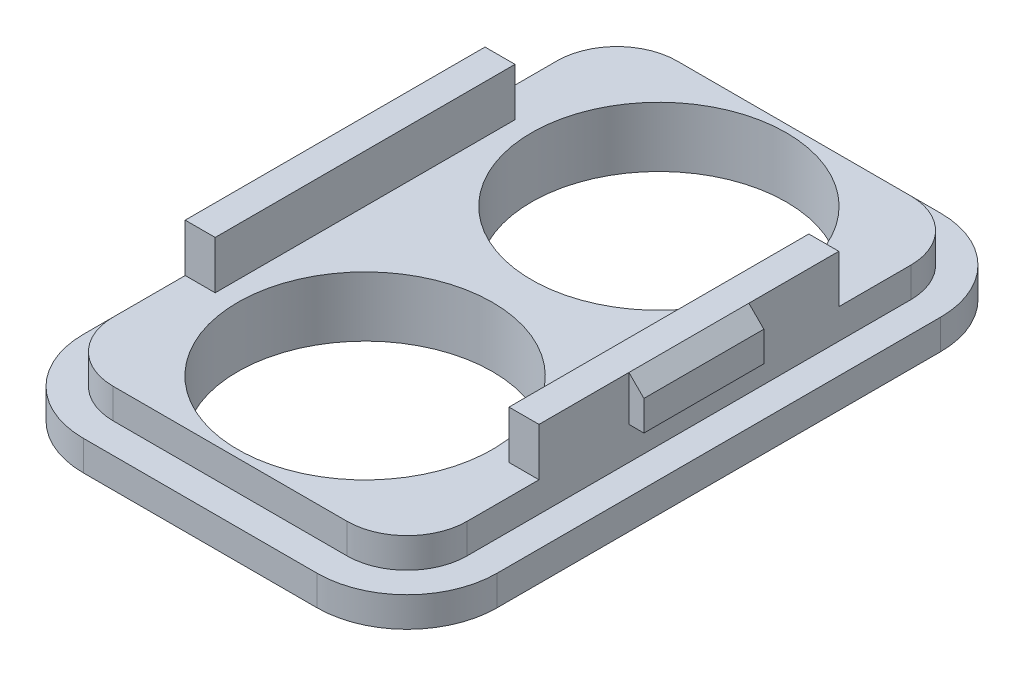
ISO-10303-21;
HEADER;
FILE_DESCRIPTION(('STEP AP214'),'2;1');
FILE_NAME('part.step','',(''),(''),'','','');
FILE_SCHEMA(('AUTOMOTIVE_DESIGN { 1 0 10303 214 1 1 1 1 }'));
ENDSEC;
DATA;
#1=APPLICATION_CONTEXT('core data for automotive mechanical design processes');
#2=APPLICATION_PROTOCOL_DEFINITION('international standard','automotive_design',2000,#1);
#3=PRODUCT_CONTEXT('',#1,'mechanical');
#4=PRODUCT('Part','Part','',(#3));
#5=PRODUCT_RELATED_PRODUCT_CATEGORY('part','',(#4));
#6=PRODUCT_DEFINITION_FORMATION('','',#4);
#7=PRODUCT_DEFINITION_CONTEXT('part definition',#1,'design');
#8=PRODUCT_DEFINITION('design','',#6,#7);
#9=PRODUCT_DEFINITION_SHAPE('','',#8);
#10=(LENGTH_UNIT() NAMED_UNIT(*) SI_UNIT(.MILLI.,.METRE.));
#11=(NAMED_UNIT(*) PLANE_ANGLE_UNIT() SI_UNIT($,.RADIAN.));
#12=(NAMED_UNIT(*) SI_UNIT($,.STERADIAN.) SOLID_ANGLE_UNIT());
#13=UNCERTAINTY_MEASURE_WITH_UNIT(LENGTH_MEASURE(1.E-05),#10,'distance_accuracy_value','');
#14=(GEOMETRIC_REPRESENTATION_CONTEXT(3) GLOBAL_UNCERTAINTY_ASSIGNED_CONTEXT((#13)) GLOBAL_UNIT_ASSIGNED_CONTEXT((#10,
#11,#12)) REPRESENTATION_CONTEXT('',''));
#15=CARTESIAN_POINT('',(0.,0.,0.));
#16=DIRECTION('',(0.,0.,1.));
#17=DIRECTION('',(1.,0.,0.));
#18=AXIS2_PLACEMENT_3D('',#15,#16,#17);
#19=CARTESIAN_POINT('',(2.,1.,-16.8));
#20=DIRECTION('',(0.,-1.,0.));
#21=DIRECTION('',(0.,0.,-1.));
#22=AXIS2_PLACEMENT_3D('',#19,#20,#21);
#23=PLANE('',#22);
#24=CARTESIAN_POINT('',(5.9,1.,-4.5));
#25=DIRECTION('',(0.,-1.,0.));
#26=DIRECTION('',(0.,0.,-1.));
#27=AXIS2_PLACEMENT_3D('',#24,#25,#26);
#28=CIRCLE('',#27,4.25);
#29=CARTESIAN_POINT('',(5.9,1.,-8.75));
#30=VERTEX_POINT('',#29);
#31=EDGE_CURVE('E265',#30,#30,#28,.T.);
#32=ORIENTED_EDGE('',*,*,#31,.T.);
#33=EDGE_LOOP('',(#32));
#34=FACE_BOUND('',#33,.T.);
#35=CARTESIAN_POINT('',(5.9,1.,-14.3));
#36=DIRECTION('',(0.,-1.,0.));
#37=DIRECTION('',(0.,0.,-1.));
#38=AXIS2_PLACEMENT_3D('',#35,#36,#37);
#39=CIRCLE('',#38,4.25);
#40=CARTESIAN_POINT('',(5.9,1.,-18.55));
#41=VERTEX_POINT('',#40);
#42=EDGE_CURVE('E1032',#41,#41,#39,.T.);
#43=ORIENTED_EDGE('',*,*,#42,.T.);
#44=EDGE_LOOP('',(#43));
#45=FACE_BOUND('',#44,.T.);
#46=DIRECTION('',(-1.,0.,0.));
#47=VECTOR('',#46,1.);
#48=CARTESIAN_POINT('',(11.8,1.,-14.4));
#49=LINE('',#48,#47);
#50=CARTESIAN_POINT('',(11.8,1.,-14.4));
#51=VERTEX_POINT('',#50);
#52=CARTESIAN_POINT('',(10.8,1.,-14.4));
#53=VERTEX_POINT('',#52);
#54=EDGE_CURVE('E307',#51,#53,#49,.T.);
#55=ORIENTED_EDGE('',*,*,#54,.F.);
#56=DIRECTION('',(0.,0.,-1.));
#57=VECTOR('',#56,1.);
#58=CARTESIAN_POINT('',(11.8,1.,-2.00000000000001));
#59=LINE('',#58,#57);
#60=CARTESIAN_POINT('',(11.8,1.,-16.8));
#61=VERTEX_POINT('',#60);
#62=EDGE_CURVE('E338',#51,#61,#59,.T.);
#63=ORIENTED_EDGE('',*,*,#62,.T.);
#64=CARTESIAN_POINT('',(9.8,1.,-16.8));
#65=DIRECTION('',(0.,1.,0.));
#66=DIRECTION('',(0.,0.,1.));
#67=AXIS2_PLACEMENT_3D('',#64,#65,#66);
#68=CIRCLE('',#67,2.);
#69=CARTESIAN_POINT('',(9.79999999999998,1.,-18.8));
#70=VERTEX_POINT('',#69);
#71=EDGE_CURVE('E341',#61,#70,#68,.T.);
#72=ORIENTED_EDGE('',*,*,#71,.T.);
#73=DIRECTION('',(-1.,0.,0.));
#74=VECTOR('',#73,1.);
#75=CARTESIAN_POINT('',(2.00000000000001,1.,-18.8));
#76=LINE('',#75,#74);
#77=CARTESIAN_POINT('',(2.00000000000001,1.,-18.8));
#78=VERTEX_POINT('',#77);
#79=EDGE_CURVE('E343',#70,#78,#76,.T.);
#80=ORIENTED_EDGE('',*,*,#79,.T.);
#81=CARTESIAN_POINT('',(2.,1.,-16.8));
#82=DIRECTION('',(0.,1.,0.));
#83=DIRECTION('',(0.,0.,-1.));
#84=AXIS2_PLACEMENT_3D('',#81,#82,#83);
#85=CIRCLE('',#84,2.);
#86=CARTESIAN_POINT('',(0.,1.,-16.8));
#87=VERTEX_POINT('',#86);
#88=EDGE_CURVE('E325',#78,#87,#85,.T.);
#89=ORIENTED_EDGE('',*,*,#88,.T.);
#90=DIRECTION('',(0.,0.,1.));
#91=VECTOR('',#90,1.);
#92=CARTESIAN_POINT('',(0.,1.,-2.00000000000001));
#93=LINE('',#92,#91);
#94=CARTESIAN_POINT('',(0.,1.,-14.4));
#95=VERTEX_POINT('',#94);
#96=EDGE_CURVE('E330',#87,#95,#93,.T.);
#97=ORIENTED_EDGE('',*,*,#96,.T.);
#98=DIRECTION('',(-1.,0.,0.));
#99=VECTOR('',#98,1.);
#100=CARTESIAN_POINT('',(0.,1.,-14.4));
#101=LINE('',#100,#99);
#102=CARTESIAN_POINT('',(0.999999999999995,1.,-14.4));
#103=VERTEX_POINT('',#102);
#104=EDGE_CURVE('E310',#103,#95,#101,.T.);
#105=ORIENTED_EDGE('',*,*,#104,.F.);
#106=DIRECTION('',(0.,0.,-1.));
#107=VECTOR('',#106,1.);
#108=CARTESIAN_POINT('',(0.999999999999995,1.,-14.4));
#109=LINE('',#108,#107);
#110=CARTESIAN_POINT('',(0.999999999999997,1.,-4.4));
#111=VERTEX_POINT('',#110);
#112=EDGE_CURVE('E306',#111,#103,#109,.T.);
#113=ORIENTED_EDGE('',*,*,#112,.F.);
#114=DIRECTION('',(1.,0.,0.));
#115=VECTOR('',#114,1.);
#116=CARTESIAN_POINT('',(0.,1.,-4.4));
#117=LINE('',#116,#115);
#118=CARTESIAN_POINT('',(0.,1.,-4.4));
#119=VERTEX_POINT('',#118);
#120=EDGE_CURVE('E303',#119,#111,#117,.T.);
#121=ORIENTED_EDGE('',*,*,#120,.F.);
#122=CARTESIAN_POINT('',(0.,1.,-2.00000000000001));
#123=VERTEX_POINT('',#122);
#124=EDGE_CURVE('E328',#119,#123,#93,.T.);
#125=ORIENTED_EDGE('',*,*,#124,.T.);
#126=CARTESIAN_POINT('',(2.,1.,-2.));
#127=DIRECTION('',(0.,1.,0.));
#128=DIRECTION('',(0.,0.,-1.));
#129=AXIS2_PLACEMENT_3D('',#126,#127,#128);
#130=CIRCLE('',#129,2.);
#131=CARTESIAN_POINT('',(2.00000000000001,1.,0.));
#132=VERTEX_POINT('',#131);
#133=EDGE_CURVE('E332',#123,#132,#130,.T.);
#134=ORIENTED_EDGE('',*,*,#133,.T.);
#135=DIRECTION('',(1.,0.,0.));
#136=VECTOR('',#135,1.);
#137=CARTESIAN_POINT('',(2.00000000000001,1.,0.));
#138=LINE('',#137,#136);
#139=CARTESIAN_POINT('',(9.79999999999999,1.,0.));
#140=VERTEX_POINT('',#139);
#141=EDGE_CURVE('E334',#132,#140,#138,.T.);
#142=ORIENTED_EDGE('',*,*,#141,.T.);
#143=CARTESIAN_POINT('',(9.8,1.,-2.));
#144=DIRECTION('',(0.,1.,0.));
#145=DIRECTION('',(0.,0.,1.));
#146=AXIS2_PLACEMENT_3D('',#143,#144,#145);
#147=CIRCLE('',#146,2.);
#148=CARTESIAN_POINT('',(11.8,1.,-2.00000000000001));
#149=VERTEX_POINT('',#148);
#150=EDGE_CURVE('E336',#140,#149,#147,.T.);
#151=ORIENTED_EDGE('',*,*,#150,.T.);
#152=CARTESIAN_POINT('',(11.8,1.,-4.40000000000001));
#153=VERTEX_POINT('',#152);
#154=EDGE_CURVE('E339',#149,#153,#59,.T.);
#155=ORIENTED_EDGE('',*,*,#154,.T.);
#156=DIRECTION('',(1.,0.,0.));
#157=VECTOR('',#156,1.);
#158=CARTESIAN_POINT('',(11.8,1.,-4.40000000000001));
#159=LINE('',#158,#157);
#160=CARTESIAN_POINT('',(10.8,1.,-4.40000000000001));
#161=VERTEX_POINT('',#160);
#162=EDGE_CURVE('E282',#161,#153,#159,.T.);
#163=ORIENTED_EDGE('',*,*,#162,.F.);
#164=DIRECTION('',(0.,0.,1.));
#165=VECTOR('',#164,1.);
#166=CARTESIAN_POINT('',(10.8,1.,-14.4));
#167=LINE('',#166,#165);
#168=EDGE_CURVE('E286',#53,#161,#167,.T.);
#169=ORIENTED_EDGE('',*,*,#168,.F.);
#170=EDGE_LOOP('',(#55,#63,#72,#80,#89,#97,#105,#113,#121,#125,#134,#142,#151,#155,#163,#169));
#171=FACE_BOUND('',#170,.T.);
#172=ADVANCED_FACE('F38',(#34,#45,#171),#23,.F.);
#173=CARTESIAN_POINT('',(2.,1.,-16.8));
#174=DIRECTION('',(0.,-1.,0.));
#175=DIRECTION('',(0.,0.,-1.));
#176=AXIS2_PLACEMENT_3D('',#173,#174,#175);
#177=CYLINDRICAL_SURFACE('',#176,2.);
#178=CARTESIAN_POINT('',(2.,0.,-16.8));
#179=DIRECTION('',(0.,1.,0.));
#180=DIRECTION('',(0.,0.,-1.));
#181=AXIS2_PLACEMENT_3D('',#178,#179,#180);
#182=CIRCLE('',#181,2.);
#183=CARTESIAN_POINT('',(2.00000000000001,0.,-18.8));
#184=VERTEX_POINT('',#183);
#185=CARTESIAN_POINT('',(0.,0.,-16.8));
#186=VERTEX_POINT('',#185);
#187=EDGE_CURVE('E324',#184,#186,#182,.T.);
#188=ORIENTED_EDGE('',*,*,#187,.T.);
#189=DIRECTION('',(0.,-1.,0.));
#190=VECTOR('',#189,1.);
#191=CARTESIAN_POINT('',(0.,1.,-16.8));
#192=LINE('',#191,#190);
#193=EDGE_CURVE('E11',#87,#186,#192,.T.);
#194=ORIENTED_EDGE('',*,*,#193,.F.);
#195=ORIENTED_EDGE('',*,*,#88,.F.);
#196=DIRECTION('',(0.,-1.,0.));
#197=VECTOR('',#196,1.);
#198=CARTESIAN_POINT('',(2.00000000000001,1.,-18.8));
#199=LINE('',#198,#197);
#200=EDGE_CURVE('E345',#78,#184,#199,.T.);
#201=ORIENTED_EDGE('',*,*,#200,.T.);
#202=EDGE_LOOP('',(#188,#194,#195,#201));
#203=FACE_BOUND('',#202,.T.);
#204=ADVANCED_FACE('F40',(#203),#177,.T.);
#205=CARTESIAN_POINT('',(0.,1.,-2.00000000000001));
#206=DIRECTION('',(1.,0.,0.));
#207=DIRECTION('',(0.,0.,-1.));
#208=AXIS2_PLACEMENT_3D('',#205,#206,#207);
#209=PLANE('',#208);
#210=DIRECTION('',(0.,0.,1.));
#211=VECTOR('',#210,1.);
#212=CARTESIAN_POINT('',(0.,1.1,-11.4));
#213=LINE('',#212,#211);
#214=CARTESIAN_POINT('',(0.,1.1,-11.4));
#215=VERTEX_POINT('',#214);
#216=CARTESIAN_POINT('',(0.,1.1,-7.4));
#217=VERTEX_POINT('',#216);
#218=EDGE_CURVE('E431',#215,#217,#213,.T.);
#219=ORIENTED_EDGE('',*,*,#218,.F.);
#220=DIRECTION('',(0.,1.,0.));
#221=VECTOR('',#220,1.);
#222=CARTESIAN_POINT('',(0.,2.6,-11.4));
#223=LINE('',#222,#221);
#224=CARTESIAN_POINT('',(0.,2.6,-11.4));
#225=VERTEX_POINT('',#224);
#226=EDGE_CURVE('E439',#215,#225,#223,.T.);
#227=ORIENTED_EDGE('',*,*,#226,.T.);
#228=DIRECTION('',(0.,0.,1.));
#229=VECTOR('',#228,1.);
#230=CARTESIAN_POINT('',(0.,2.6,-14.4));
#231=LINE('',#230,#229);
#232=CARTESIAN_POINT('',(0.,2.6,-14.4));
#233=VERTEX_POINT('',#232);
#234=EDGE_CURVE('E292',#233,#225,#231,.T.);
#235=ORIENTED_EDGE('',*,*,#234,.F.);
#236=DIRECTION('',(0.,-1.,0.));
#237=VECTOR('',#236,1.);
#238=CARTESIAN_POINT('',(0.,2.6,-14.4));
#239=LINE('',#238,#237);
#240=EDGE_CURVE('E302',#233,#95,#239,.T.);
#241=ORIENTED_EDGE('',*,*,#240,.T.);
#242=ORIENTED_EDGE('',*,*,#96,.F.);
#243=ORIENTED_EDGE('',*,*,#193,.T.);
#244=DIRECTION('',(0.,0.,1.));
#245=VECTOR('',#244,1.);
#246=CARTESIAN_POINT('',(0.,0.,-2.00000000000001));
#247=LINE('',#246,#245);
#248=CARTESIAN_POINT('',(0.,0.,-2.00000000000001));
#249=VERTEX_POINT('',#248);
#250=EDGE_CURVE('E348',#186,#249,#247,.T.);
#251=ORIENTED_EDGE('',*,*,#250,.T.);
#252=DIRECTION('',(0.,-1.,0.));
#253=VECTOR('',#252,1.);
#254=CARTESIAN_POINT('',(0.,1.,-2.00000000000001));
#255=LINE('',#254,#253);
#256=EDGE_CURVE('E46',#123,#249,#255,.T.);
#257=ORIENTED_EDGE('',*,*,#256,.F.);
#258=ORIENTED_EDGE('',*,*,#124,.F.);
#259=DIRECTION('',(0.,-1.,0.));
#260=VECTOR('',#259,1.);
#261=CARTESIAN_POINT('',(0.,2.6,-4.4));
#262=LINE('',#261,#260);
#263=CARTESIAN_POINT('',(0.,2.6,-4.4));
#264=VERTEX_POINT('',#263);
#265=EDGE_CURVE('E321',#264,#119,#262,.T.);
#266=ORIENTED_EDGE('',*,*,#265,.F.);
#267=CARTESIAN_POINT('',(0.,2.6,-7.4));
#268=VERTEX_POINT('',#267);
#269=EDGE_CURVE('E296',#268,#264,#231,.T.);
#270=ORIENTED_EDGE('',*,*,#269,.F.);
#271=DIRECTION('',(0.,1.,0.));
#272=VECTOR('',#271,1.);
#273=CARTESIAN_POINT('',(0.,2.6,-7.4));
#274=LINE('',#273,#272);
#275=EDGE_CURVE('E425',#217,#268,#274,.T.);
#276=ORIENTED_EDGE('',*,*,#275,.F.);
#277=EDGE_LOOP('',(#219,#227,#235,#241,#242,#243,#251,#257,#258,#266,#270,#276));
#278=FACE_BOUND('',#277,.T.);
#279=ADVANCED_FACE('F393',(#278),#209,.F.);
#280=CARTESIAN_POINT('',(2.,1.,-2.));
#281=DIRECTION('',(0.,-1.,0.));
#282=DIRECTION('',(0.,0.,-1.));
#283=AXIS2_PLACEMENT_3D('',#280,#281,#282);
#284=CYLINDRICAL_SURFACE('',#283,2.);
#285=CARTESIAN_POINT('',(2.,0.,-2.));
#286=DIRECTION('',(0.,1.,0.));
#287=DIRECTION('',(0.,0.,-1.));
#288=AXIS2_PLACEMENT_3D('',#285,#286,#287);
#289=CIRCLE('',#288,2.);
#290=CARTESIAN_POINT('',(2.00000000000001,0.,0.));
#291=VERTEX_POINT('',#290);
#292=EDGE_CURVE('E351',#249,#291,#289,.T.);
#293=ORIENTED_EDGE('',*,*,#292,.T.);
#294=DIRECTION('',(0.,-1.,0.));
#295=VECTOR('',#294,1.);
#296=CARTESIAN_POINT('',(2.00000000000001,1.,0.));
#297=LINE('',#296,#295);
#298=EDGE_CURVE('E382',#132,#291,#297,.T.);
#299=ORIENTED_EDGE('',*,*,#298,.F.);
#300=ORIENTED_EDGE('',*,*,#133,.F.);
#301=ORIENTED_EDGE('',*,*,#256,.T.);
#302=EDGE_LOOP('',(#293,#299,#300,#301));
#303=FACE_BOUND('',#302,.T.);
#304=ADVANCED_FACE('F388',(#303),#284,.T.);
#305=CARTESIAN_POINT('',(2.00000000000001,1.,0.));
#306=DIRECTION('',(0.,0.,-1.));
#307=DIRECTION('',(-1.,0.,0.));
#308=AXIS2_PLACEMENT_3D('',#305,#306,#307);
#309=PLANE('',#308);
#310=DIRECTION('',(1.,0.,0.));
#311=VECTOR('',#310,1.);
#312=CARTESIAN_POINT('',(2.00000000000001,0.,0.));
#313=LINE('',#312,#311);
#314=CARTESIAN_POINT('',(9.79999999999999,0.,0.));
#315=VERTEX_POINT('',#314);
#316=EDGE_CURVE('E354',#291,#315,#313,.T.);
#317=ORIENTED_EDGE('',*,*,#316,.T.);
#318=DIRECTION('',(0.,-1.,0.));
#319=VECTOR('',#318,1.);
#320=CARTESIAN_POINT('',(9.79999999999999,1.,0.));
#321=LINE('',#320,#319);
#322=EDGE_CURVE('E379',#140,#315,#321,.T.);
#323=ORIENTED_EDGE('',*,*,#322,.F.);
#324=ORIENTED_EDGE('',*,*,#141,.F.);
#325=ORIENTED_EDGE('',*,*,#298,.T.);
#326=EDGE_LOOP('',(#317,#323,#324,#325));
#327=FACE_BOUND('',#326,.T.);
#328=ADVANCED_FACE('F401',(#327),#309,.F.);
#329=CARTESIAN_POINT('',(9.8,1.,-2.));
#330=DIRECTION('',(0.,-1.,0.));
#331=DIRECTION('',(0.,0.,-1.));
#332=AXIS2_PLACEMENT_3D('',#329,#330,#331);
#333=CYLINDRICAL_SURFACE('',#332,2.);
#334=CARTESIAN_POINT('',(9.8,0.,-2.));
#335=DIRECTION('',(0.,1.,0.));
#336=DIRECTION('',(0.,0.,1.));
#337=AXIS2_PLACEMENT_3D('',#334,#335,#336);
#338=CIRCLE('',#337,2.);
#339=CARTESIAN_POINT('',(11.8,0.,-2.00000000000001));
#340=VERTEX_POINT('',#339);
#341=EDGE_CURVE('E357',#315,#340,#338,.T.);
#342=ORIENTED_EDGE('',*,*,#341,.T.);
#343=DIRECTION('',(0.,-1.,0.));
#344=VECTOR('',#343,1.);
#345=CARTESIAN_POINT('',(11.8,1.,-2.00000000000001));
#346=LINE('',#345,#344);
#347=EDGE_CURVE('E376',#149,#340,#346,.T.);
#348=ORIENTED_EDGE('',*,*,#347,.F.);
#349=ORIENTED_EDGE('',*,*,#150,.F.);
#350=ORIENTED_EDGE('',*,*,#322,.T.);
#351=EDGE_LOOP('',(#342,#348,#349,#350));
#352=FACE_BOUND('',#351,.T.);
#353=ADVANCED_FACE('F405',(#352),#333,.T.);
#354=CARTESIAN_POINT('',(11.8,1.,-2.00000000000001));
#355=DIRECTION('',(-1.,0.,0.));
#356=DIRECTION('',(0.,0.,1.));
#357=AXIS2_PLACEMENT_3D('',#354,#355,#356);
#358=PLANE('',#357);
#359=DIRECTION('',(0.,0.,-1.));
#360=VECTOR('',#359,1.);
#361=CARTESIAN_POINT('',(11.8,2.6,-14.4));
#362=LINE('',#361,#360);
#363=CARTESIAN_POINT('',(11.8,2.6,-11.4));
#364=VERTEX_POINT('',#363);
#365=CARTESIAN_POINT('',(11.8,2.6,-14.4));
#366=VERTEX_POINT('',#365);
#367=EDGE_CURVE('E283',#364,#366,#362,.T.);
#368=ORIENTED_EDGE('',*,*,#367,.F.);
#369=DIRECTION('',(0.,1.,0.));
#370=VECTOR('',#369,1.);
#371=CARTESIAN_POINT('',(11.8,2.6,-11.4));
#372=LINE('',#371,#370);
#373=CARTESIAN_POINT('',(11.8,1.1,-11.4));
#374=VERTEX_POINT('',#373);
#375=EDGE_CURVE('E475',#374,#364,#372,.T.);
#376=ORIENTED_EDGE('',*,*,#375,.F.);
#377=DIRECTION('',(0.,0.,1.));
#378=VECTOR('',#377,1.);
#379=CARTESIAN_POINT('',(11.8,1.1,-11.4));
#380=LINE('',#379,#378);
#381=CARTESIAN_POINT('',(11.8,1.1,-7.40000000000001));
#382=VERTEX_POINT('',#381);
#383=EDGE_CURVE('E254',#374,#382,#380,.T.);
#384=ORIENTED_EDGE('',*,*,#383,.T.);
#385=DIRECTION('',(0.,1.,0.));
#386=VECTOR('',#385,1.);
#387=CARTESIAN_POINT('',(11.8,2.6,-7.40000000000001));
#388=LINE('',#387,#386);
#389=CARTESIAN_POINT('',(11.8,2.6,-7.40000000000001));
#390=VERTEX_POINT('',#389);
#391=EDGE_CURVE('E261',#382,#390,#388,.T.);
#392=ORIENTED_EDGE('',*,*,#391,.T.);
#393=CARTESIAN_POINT('',(11.8,2.6,-4.40000000000001));
#394=VERTEX_POINT('',#393);
#395=EDGE_CURVE('E273',#394,#390,#362,.T.);
#396=ORIENTED_EDGE('',*,*,#395,.F.);
#397=DIRECTION('',(0.,-1.,0.));
#398=VECTOR('',#397,1.);
#399=CARTESIAN_POINT('',(11.8,2.6,-4.40000000000001));
#400=LINE('',#399,#398);
#401=EDGE_CURVE('E450',#394,#153,#400,.T.);
#402=ORIENTED_EDGE('',*,*,#401,.T.);
#403=ORIENTED_EDGE('',*,*,#154,.F.);
#404=ORIENTED_EDGE('',*,*,#347,.T.);
#405=DIRECTION('',(0.,0.,-1.));
#406=VECTOR('',#405,1.);
#407=CARTESIAN_POINT('',(11.8,0.,-2.00000000000001));
#408=LINE('',#407,#406);
#409=CARTESIAN_POINT('',(11.8,0.,-16.8));
#410=VERTEX_POINT('',#409);
#411=EDGE_CURVE('E360',#340,#410,#408,.T.);
#412=ORIENTED_EDGE('',*,*,#411,.T.);
#413=DIRECTION('',(0.,-1.,0.));
#414=VECTOR('',#413,1.);
#415=CARTESIAN_POINT('',(11.8,1.,-16.8));
#416=LINE('',#415,#414);
#417=EDGE_CURVE('E373',#61,#410,#416,.T.);
#418=ORIENTED_EDGE('',*,*,#417,.F.);
#419=ORIENTED_EDGE('',*,*,#62,.F.);
#420=DIRECTION('',(0.,-1.,0.));
#421=VECTOR('',#420,1.);
#422=CARTESIAN_POINT('',(11.8,2.6,-14.4));
#423=LINE('',#422,#421);
#424=EDGE_CURVE('E430',#366,#51,#423,.T.);
#425=ORIENTED_EDGE('',*,*,#424,.F.);
#426=EDGE_LOOP('',(#368,#376,#384,#392,#396,#402,#403,#404,#412,#418,#419,#425));
#427=FACE_BOUND('',#426,.T.);
#428=ADVANCED_FACE('F271',(#427),#358,.F.);
#429=CARTESIAN_POINT('',(9.8,1.,-16.8));
#430=DIRECTION('',(0.,-1.,0.));
#431=DIRECTION('',(0.,0.,-1.));
#432=AXIS2_PLACEMENT_3D('',#429,#430,#431);
#433=CYLINDRICAL_SURFACE('',#432,2.);
#434=CARTESIAN_POINT('',(9.8,0.,-16.8));
#435=DIRECTION('',(0.,1.,0.));
#436=DIRECTION('',(0.,0.,1.));
#437=AXIS2_PLACEMENT_3D('',#434,#435,#436);
#438=CIRCLE('',#437,2.);
#439=CARTESIAN_POINT('',(9.79999999999998,0.,-18.8));
#440=VERTEX_POINT('',#439);
#441=EDGE_CURVE('E363',#410,#440,#438,.T.);
#442=ORIENTED_EDGE('',*,*,#441,.T.);
#443=DIRECTION('',(0.,-1.,0.));
#444=VECTOR('',#443,1.);
#445=CARTESIAN_POINT('',(9.79999999999998,1.,-18.8));
#446=LINE('',#445,#444);
#447=EDGE_CURVE('E370',#70,#440,#446,.T.);
#448=ORIENTED_EDGE('',*,*,#447,.F.);
#449=ORIENTED_EDGE('',*,*,#71,.F.);
#450=ORIENTED_EDGE('',*,*,#417,.T.);
#451=EDGE_LOOP('',(#442,#448,#449,#450));
#452=FACE_BOUND('',#451,.T.);
#453=ADVANCED_FACE('F471',(#452),#433,.T.);
#454=CARTESIAN_POINT('',(2.00000000000001,1.,-18.8));
#455=DIRECTION('',(0.,0.,1.));
#456=DIRECTION('',(1.,0.,0.));
#457=AXIS2_PLACEMENT_3D('',#454,#455,#456);
#458=PLANE('',#457);
#459=DIRECTION('',(-1.,0.,0.));
#460=VECTOR('',#459,1.);
#461=CARTESIAN_POINT('',(2.00000000000001,0.,-18.8));
#462=LINE('',#461,#460);
#463=EDGE_CURVE('E329',#440,#184,#462,.T.);
#464=ORIENTED_EDGE('',*,*,#463,.T.);
#465=ORIENTED_EDGE('',*,*,#200,.F.);
#466=ORIENTED_EDGE('',*,*,#79,.F.);
#467=ORIENTED_EDGE('',*,*,#447,.T.);
#468=EDGE_LOOP('',(#464,#465,#466,#467));
#469=FACE_BOUND('',#468,.T.);
#470=ADVANCED_FACE('F596',(#469),#458,.F.);
#471=CARTESIAN_POINT('',(0.,2.6,-4.4));
#472=DIRECTION('',(0.,0.,-1.));
#473=DIRECTION('',(-1.,0.,0.));
#474=AXIS2_PLACEMENT_3D('',#471,#472,#473);
#475=PLANE('',#474);
#476=ORIENTED_EDGE('',*,*,#120,.T.);
#477=DIRECTION('',(0.,-1.,0.));
#478=VECTOR('',#477,1.);
#479=CARTESIAN_POINT('',(0.999999999999997,2.6,-4.4));
#480=LINE('',#479,#478);
#481=CARTESIAN_POINT('',(0.999999999999997,2.6,-4.4));
#482=VERTEX_POINT('',#481);
#483=EDGE_CURVE('E318',#482,#111,#480,.T.);
#484=ORIENTED_EDGE('',*,*,#483,.F.);
#485=DIRECTION('',(1.,0.,0.));
#486=VECTOR('',#485,1.);
#487=CARTESIAN_POINT('',(0.,2.6,-4.4));
#488=LINE('',#487,#486);
#489=EDGE_CURVE('E295',#264,#482,#488,.T.);
#490=ORIENTED_EDGE('',*,*,#489,.F.);
#491=ORIENTED_EDGE('',*,*,#265,.T.);
#492=EDGE_LOOP('',(#476,#484,#490,#491));
#493=FACE_BOUND('',#492,.T.);
#494=ADVANCED_FACE('F412',(#493),#475,.F.);
#495=CARTESIAN_POINT('',(0.999999999999995,2.6,-14.4));
#496=DIRECTION('',(-1.,0.,0.));
#497=DIRECTION('',(0.,0.,1.));
#498=AXIS2_PLACEMENT_3D('',#495,#496,#497);
#499=PLANE('',#498);
#500=ORIENTED_EDGE('',*,*,#112,.T.);
#501=DIRECTION('',(0.,-1.,0.));
#502=VECTOR('',#501,1.);
#503=CARTESIAN_POINT('',(0.999999999999995,2.6,-14.4));
#504=LINE('',#503,#502);
#505=CARTESIAN_POINT('',(0.999999999999995,2.6,-14.4));
#506=VERTEX_POINT('',#505);
#507=EDGE_CURVE('E315',#506,#103,#504,.T.);
#508=ORIENTED_EDGE('',*,*,#507,.F.);
#509=DIRECTION('',(0.,0.,-1.));
#510=VECTOR('',#509,1.);
#511=CARTESIAN_POINT('',(0.999999999999995,2.6,-14.4));
#512=LINE('',#511,#510);
#513=EDGE_CURVE('E298',#482,#506,#512,.T.);
#514=ORIENTED_EDGE('',*,*,#513,.F.);
#515=ORIENTED_EDGE('',*,*,#483,.T.);
#516=EDGE_LOOP('',(#500,#508,#514,#515));
#517=FACE_BOUND('',#516,.T.);
#518=ADVANCED_FACE('F416',(#517),#499,.F.);
#519=CARTESIAN_POINT('',(0.,2.6,-14.4));
#520=DIRECTION('',(0.,0.,1.));
#521=DIRECTION('',(1.,0.,0.));
#522=AXIS2_PLACEMENT_3D('',#519,#520,#521);
#523=PLANE('',#522);
#524=ORIENTED_EDGE('',*,*,#104,.T.);
#525=ORIENTED_EDGE('',*,*,#240,.F.);
#526=DIRECTION('',(-1.,0.,0.));
#527=VECTOR('',#526,1.);
#528=CARTESIAN_POINT('',(0.,2.6,-14.4));
#529=LINE('',#528,#527);
#530=EDGE_CURVE('E300',#506,#233,#529,.T.);
#531=ORIENTED_EDGE('',*,*,#530,.F.);
#532=ORIENTED_EDGE('',*,*,#507,.T.);
#533=EDGE_LOOP('',(#524,#525,#531,#532));
#534=FACE_BOUND('',#533,.T.);
#535=ADVANCED_FACE('F652',(#534),#523,.F.);
#536=CARTESIAN_POINT('',(0.,2.6,0.));
#537=DIRECTION('',(0.,1.,0.));
#538=DIRECTION('',(0.,0.,1.));
#539=AXIS2_PLACEMENT_3D('',#536,#537,#538);
#540=PLANE('',#539);
#541=ORIENTED_EDGE('',*,*,#234,.T.);
#542=DIRECTION('',(0.,0.,1.));
#543=VECTOR('',#542,1.);
#544=CARTESIAN_POINT('',(0.,2.6,-11.4));
#545=LINE('',#544,#543);
#546=EDGE_CURVE('E426',#225,#268,#545,.T.);
#547=ORIENTED_EDGE('',*,*,#546,.T.);
#548=ORIENTED_EDGE('',*,*,#269,.T.);
#549=ORIENTED_EDGE('',*,*,#489,.T.);
#550=ORIENTED_EDGE('',*,*,#513,.T.);
#551=ORIENTED_EDGE('',*,*,#530,.T.);
#552=EDGE_LOOP('',(#541,#547,#548,#549,#550,#551));
#553=FACE_BOUND('',#552,.T.);
#554=ADVANCED_FACE('F420',(#553),#540,.T.);
#555=CARTESIAN_POINT('',(11.8,2.6,-14.4));
#556=DIRECTION('',(0.,0.,1.));
#557=DIRECTION('',(1.,0.,0.));
#558=AXIS2_PLACEMENT_3D('',#555,#556,#557);
#559=PLANE('',#558);
#560=ORIENTED_EDGE('',*,*,#54,.T.);
#561=DIRECTION('',(0.,-1.,0.));
#562=VECTOR('',#561,1.);
#563=CARTESIAN_POINT('',(10.8,2.6,-14.4));
#564=LINE('',#563,#562);
#565=CARTESIAN_POINT('',(10.8,2.6,-14.4));
#566=VERTEX_POINT('',#565);
#567=EDGE_CURVE('E434',#566,#53,#564,.T.);
#568=ORIENTED_EDGE('',*,*,#567,.F.);
#569=DIRECTION('',(-1.,0.,0.));
#570=VECTOR('',#569,1.);
#571=CARTESIAN_POINT('',(11.8,2.6,-14.4));
#572=LINE('',#571,#570);
#573=EDGE_CURVE('E288',#366,#566,#572,.T.);
#574=ORIENTED_EDGE('',*,*,#573,.F.);
#575=ORIENTED_EDGE('',*,*,#424,.T.);
#576=EDGE_LOOP('',(#560,#568,#574,#575));
#577=FACE_BOUND('',#576,.T.);
#578=ADVANCED_FACE('F463',(#577),#559,.F.);
#579=CARTESIAN_POINT('',(10.8,2.6,-14.4));
#580=DIRECTION('',(1.,0.,0.));
#581=DIRECTION('',(0.,0.,-1.));
#582=AXIS2_PLACEMENT_3D('',#579,#580,#581);
#583=PLANE('',#582);
#584=ORIENTED_EDGE('',*,*,#168,.T.);
#585=DIRECTION('',(0.,-1.,0.));
#586=VECTOR('',#585,1.);
#587=CARTESIAN_POINT('',(10.8,2.6,-4.40000000000001));
#588=LINE('',#587,#586);
#589=CARTESIAN_POINT('',(10.8,2.6,-4.40000000000001));
#590=VERTEX_POINT('',#589);
#591=EDGE_CURVE('E447',#590,#161,#588,.T.);
#592=ORIENTED_EDGE('',*,*,#591,.F.);
#593=DIRECTION('',(0.,0.,1.));
#594=VECTOR('',#593,1.);
#595=CARTESIAN_POINT('',(10.8,2.6,-14.4));
#596=LINE('',#595,#594);
#597=EDGE_CURVE('E456',#566,#590,#596,.T.);
#598=ORIENTED_EDGE('',*,*,#597,.F.);
#599=ORIENTED_EDGE('',*,*,#567,.T.);
#600=EDGE_LOOP('',(#584,#592,#598,#599));
#601=FACE_BOUND('',#600,.T.);
#602=ADVANCED_FACE('F465',(#601),#583,.F.);
#603=CARTESIAN_POINT('',(11.8,2.6,-4.40000000000001));
#604=DIRECTION('',(0.,0.,-1.));
#605=DIRECTION('',(-1.,0.,0.));
#606=AXIS2_PLACEMENT_3D('',#603,#604,#605);
#607=PLANE('',#606);
#608=ORIENTED_EDGE('',*,*,#162,.T.);
#609=ORIENTED_EDGE('',*,*,#401,.F.);
#610=DIRECTION('',(1.,0.,0.));
#611=VECTOR('',#610,1.);
#612=CARTESIAN_POINT('',(11.8,2.6,-4.40000000000001));
#613=LINE('',#612,#611);
#614=EDGE_CURVE('E280',#590,#394,#613,.T.);
#615=ORIENTED_EDGE('',*,*,#614,.F.);
#616=ORIENTED_EDGE('',*,*,#591,.T.);
#617=EDGE_LOOP('',(#608,#609,#615,#616));
#618=FACE_BOUND('',#617,.T.);
#619=ADVANCED_FACE('F467',(#618),#607,.F.);
#620=CARTESIAN_POINT('',(0.,2.6,0.));
#621=DIRECTION('',(0.,-1.,0.));
#622=DIRECTION('',(0.,0.,-1.));
#623=AXIS2_PLACEMENT_3D('',#620,#621,#622);
#624=PLANE('',#623);
#625=ORIENTED_EDGE('',*,*,#395,.T.);
#626=DIRECTION('',(0.,0.,1.));
#627=VECTOR('',#626,1.);
#628=CARTESIAN_POINT('',(11.8,2.6,-11.4));
#629=LINE('',#628,#627);
#630=EDGE_CURVE('E247',#364,#390,#629,.T.);
#631=ORIENTED_EDGE('',*,*,#630,.F.);
#632=ORIENTED_EDGE('',*,*,#367,.T.);
#633=ORIENTED_EDGE('',*,*,#573,.T.);
#634=ORIENTED_EDGE('',*,*,#597,.T.);
#635=ORIENTED_EDGE('',*,*,#614,.T.);
#636=EDGE_LOOP('',(#625,#631,#632,#633,#634,#635));
#637=FACE_BOUND('',#636,.T.);
#638=ADVANCED_FACE('F278',(#637),#624,.F.);
#639=CARTESIAN_POINT('',(-0.5,2.1,-11.4));
#640=DIRECTION('',(-0.707106781186551,0.707106781186544,0.));
#641=DIRECTION('',(-0.707106781186544,-0.707106781186551,0.));
#642=AXIS2_PLACEMENT_3D('',#639,#640,#641);
#643=PLANE('',#642);
#644=DIRECTION('',(0.,0.,1.));
#645=VECTOR('',#644,1.);
#646=CARTESIAN_POINT('',(-0.5,2.1,-11.4));
#647=LINE('',#646,#645);
#648=CARTESIAN_POINT('',(-0.5,2.1,-11.4));
#649=VERTEX_POINT('',#648);
#650=CARTESIAN_POINT('',(-0.5,2.1,-7.4));
#651=VERTEX_POINT('',#650);
#652=EDGE_CURVE('E443',#649,#651,#647,.T.);
#653=ORIENTED_EDGE('',*,*,#652,.T.);
#654=DIRECTION('',(-0.707106781186544,-0.707106781186551,0.));
#655=VECTOR('',#654,1.);
#656=CARTESIAN_POINT('',(-0.5,2.1,-7.4));
#657=LINE('',#656,#655);
#658=EDGE_CURVE('E61',#268,#651,#657,.T.);
#659=ORIENTED_EDGE('',*,*,#658,.F.);
#660=ORIENTED_EDGE('',*,*,#546,.F.);
#661=DIRECTION('',(-0.707106781186544,-0.707106781186551,0.));
#662=VECTOR('',#661,1.);
#663=CARTESIAN_POINT('',(-0.5,2.1,-11.4));
#664=LINE('',#663,#662);
#665=EDGE_CURVE('E555',#225,#649,#664,.T.);
#666=ORIENTED_EDGE('',*,*,#665,.T.);
#667=EDGE_LOOP('',(#653,#659,#660,#666));
#668=FACE_BOUND('',#667,.T.);
#669=ADVANCED_FACE('F567',(#668),#643,.T.);
#670=CARTESIAN_POINT('',(0.,1.1,-11.4));
#671=DIRECTION('',(0.,-1.,0.));
#672=DIRECTION('',(0.,0.,-1.));
#673=AXIS2_PLACEMENT_3D('',#670,#671,#672);
#674=PLANE('',#673);
#675=ORIENTED_EDGE('',*,*,#218,.T.);
#676=DIRECTION('',(1.,0.,0.));
#677=VECTOR('',#676,1.);
#678=CARTESIAN_POINT('',(0.,1.1,-7.4));
#679=LINE('',#678,#677);
#680=CARTESIAN_POINT('',(-0.5,1.1,-7.4));
#681=VERTEX_POINT('',#680);
#682=EDGE_CURVE('E551',#681,#217,#679,.T.);
#683=ORIENTED_EDGE('',*,*,#682,.F.);
#684=DIRECTION('',(0.,0.,1.));
#685=VECTOR('',#684,1.);
#686=CARTESIAN_POINT('',(-0.5,1.1,-11.4));
#687=LINE('',#686,#685);
#688=CARTESIAN_POINT('',(-0.5,1.1,-11.4));
#689=VERTEX_POINT('',#688);
#690=EDGE_CURVE('E436',#689,#681,#687,.T.);
#691=ORIENTED_EDGE('',*,*,#690,.F.);
#692=DIRECTION('',(1.,0.,0.));
#693=VECTOR('',#692,1.);
#694=CARTESIAN_POINT('',(0.,1.1,-11.4));
#695=LINE('',#694,#693);
#696=EDGE_CURVE('E559',#689,#215,#695,.T.);
#697=ORIENTED_EDGE('',*,*,#696,.T.);
#698=EDGE_LOOP('',(#675,#683,#691,#697));
#699=FACE_BOUND('',#698,.T.);
#700=ADVANCED_FACE('F574',(#699),#674,.T.);
#701=CARTESIAN_POINT('',(-0.5,1.1,-11.4));
#702=DIRECTION('',(-1.,0.,0.));
#703=DIRECTION('',(0.,-1.,0.));
#704=AXIS2_PLACEMENT_3D('',#701,#702,#703);
#705=PLANE('',#704);
#706=ORIENTED_EDGE('',*,*,#690,.T.);
#707=DIRECTION('',(0.,-1.,0.));
#708=VECTOR('',#707,1.);
#709=CARTESIAN_POINT('',(-0.5,1.1,-7.4));
#710=LINE('',#709,#708);
#711=EDGE_CURVE('E548',#651,#681,#710,.T.);
#712=ORIENTED_EDGE('',*,*,#711,.F.);
#713=ORIENTED_EDGE('',*,*,#652,.F.);
#714=DIRECTION('',(0.,-1.,0.));
#715=VECTOR('',#714,1.);
#716=CARTESIAN_POINT('',(-0.5,1.1,-11.4));
#717=LINE('',#716,#715);
#718=EDGE_CURVE('E557',#649,#689,#717,.T.);
#719=ORIENTED_EDGE('',*,*,#718,.T.);
#720=EDGE_LOOP('',(#706,#712,#713,#719));
#721=FACE_BOUND('',#720,.T.);
#722=ADVANCED_FACE('F570',(#721),#705,.T.);
#723=CARTESIAN_POINT('',(0.,0.,-11.4));
#724=DIRECTION('',(0.,0.,-1.));
#725=DIRECTION('',(-1.,0.,0.));
#726=AXIS2_PLACEMENT_3D('',#723,#724,#725);
#727=PLANE('',#726);
#728=ORIENTED_EDGE('',*,*,#665,.F.);
#729=ORIENTED_EDGE('',*,*,#226,.F.);
#730=ORIENTED_EDGE('',*,*,#696,.F.);
#731=ORIENTED_EDGE('',*,*,#718,.F.);
#732=EDGE_LOOP('',(#728,#729,#730,#731));
#733=FACE_BOUND('',#732,.T.);
#734=ADVANCED_FACE('F565',(#733),#727,.T.);
#735=CARTESIAN_POINT('',(0.,0.,-7.4));
#736=DIRECTION('',(0.,0.,-1.));
#737=DIRECTION('',(-1.,0.,0.));
#738=AXIS2_PLACEMENT_3D('',#735,#736,#737);
#739=PLANE('',#738);
#740=ORIENTED_EDGE('',*,*,#658,.T.);
#741=ORIENTED_EDGE('',*,*,#711,.T.);
#742=ORIENTED_EDGE('',*,*,#682,.T.);
#743=ORIENTED_EDGE('',*,*,#275,.T.);
#744=EDGE_LOOP('',(#740,#741,#742,#743));
#745=FACE_BOUND('',#744,.T.);
#746=ADVANCED_FACE('F573',(#745),#739,.F.);
#747=CARTESIAN_POINT('',(2.,-1.,-16.8));
#748=DIRECTION('',(0.,1.,0.));
#749=DIRECTION('',(0.,0.,1.));
#750=AXIS2_PLACEMENT_3D('',#747,#748,#749);
#751=CYLINDRICAL_SURFACE('',#750,3.);
#752=CARTESIAN_POINT('',(2.,0.,-16.8));
#753=DIRECTION('',(0.,-1.,0.));
#754=DIRECTION('',(0.,0.,-1.));
#755=AXIS2_PLACEMENT_3D('',#752,#753,#754);
#756=CIRCLE('',#755,3.);
#757=CARTESIAN_POINT('',(-1.,0.,-16.8));
#758=VERTEX_POINT('',#757);
#759=CARTESIAN_POINT('',(2.00000000000002,0.,-19.8));
#760=VERTEX_POINT('',#759);
#761=EDGE_CURVE('E486',#758,#760,#756,.T.);
#762=ORIENTED_EDGE('',*,*,#761,.T.);
#763=DIRECTION('',(0.,1.,0.));
#764=VECTOR('',#763,1.);
#765=CARTESIAN_POINT('',(2.00000000000002,-1.,-19.8));
#766=LINE('',#765,#764);
#767=CARTESIAN_POINT('',(2.00000000000002,-1.,-19.8));
#768=VERTEX_POINT('',#767);
#769=EDGE_CURVE('E544',#768,#760,#766,.T.);
#770=ORIENTED_EDGE('',*,*,#769,.F.);
#771=CARTESIAN_POINT('',(2.,-1.,-16.8));
#772=DIRECTION('',(0.,-1.,0.));
#773=DIRECTION('',(0.,0.,-1.));
#774=AXIS2_PLACEMENT_3D('',#771,#772,#773);
#775=CIRCLE('',#774,3.);
#776=CARTESIAN_POINT('',(-1.,-1.,-16.8));
#777=VERTEX_POINT('',#776);
#778=EDGE_CURVE('E490',#777,#768,#775,.T.);
#779=ORIENTED_EDGE('',*,*,#778,.F.);
#780=DIRECTION('',(0.,1.,0.));
#781=VECTOR('',#780,1.);
#782=CARTESIAN_POINT('',(-1.,-1.,-16.8));
#783=LINE('',#782,#781);
#784=EDGE_CURVE('E508',#777,#758,#783,.T.);
#785=ORIENTED_EDGE('',*,*,#784,.T.);
#786=EDGE_LOOP('',(#762,#770,#779,#785));
#787=FACE_BOUND('',#786,.T.);
#788=ADVANCED_FACE('F722',(#787),#751,.T.);
#789=CARTESIAN_POINT('',(2.00000000000002,-1.,-19.8));
#790=DIRECTION('',(0.,0.,1.));
#791=DIRECTION('',(1.,0.,0.));
#792=AXIS2_PLACEMENT_3D('',#789,#790,#791);
#793=PLANE('',#792);
#794=DIRECTION('',(1.,0.,0.));
#795=VECTOR('',#794,1.);
#796=CARTESIAN_POINT('',(2.00000000000002,0.,-19.8));
#797=LINE('',#796,#795);
#798=CARTESIAN_POINT('',(9.79999999999998,0.,-19.8));
#799=VERTEX_POINT('',#798);
#800=EDGE_CURVE('E511',#760,#799,#797,.T.);
#801=ORIENTED_EDGE('',*,*,#800,.T.);
#802=DIRECTION('',(0.,1.,0.));
#803=VECTOR('',#802,1.);
#804=CARTESIAN_POINT('',(9.79999999999998,-1.,-19.8));
#805=LINE('',#804,#803);
#806=CARTESIAN_POINT('',(9.79999999999998,-1.,-19.8));
#807=VERTEX_POINT('',#806);
#808=EDGE_CURVE('E541',#807,#799,#805,.T.);
#809=ORIENTED_EDGE('',*,*,#808,.F.);
#810=DIRECTION('',(1.,0.,0.));
#811=VECTOR('',#810,1.);
#812=CARTESIAN_POINT('',(2.00000000000002,-1.,-19.8));
#813=LINE('',#812,#811);
#814=EDGE_CURVE('E493',#768,#807,#813,.T.);
#815=ORIENTED_EDGE('',*,*,#814,.F.);
#816=ORIENTED_EDGE('',*,*,#769,.T.);
#817=EDGE_LOOP('',(#801,#809,#815,#816));
#818=FACE_BOUND('',#817,.T.);
#819=ADVANCED_FACE('F921',(#818),#793,.F.);
#820=CARTESIAN_POINT('',(9.8,-1.,-16.8));
#821=DIRECTION('',(0.,1.,0.));
#822=DIRECTION('',(0.,0.,1.));
#823=AXIS2_PLACEMENT_3D('',#820,#821,#822);
#824=CYLINDRICAL_SURFACE('',#823,3.);
#825=CARTESIAN_POINT('',(9.8,0.,-16.8));
#826=DIRECTION('',(0.,-1.,0.));
#827=DIRECTION('',(0.,0.,-1.));
#828=AXIS2_PLACEMENT_3D('',#825,#826,#827);
#829=CIRCLE('',#828,3.);
#830=CARTESIAN_POINT('',(12.8,0.,-16.8));
#831=VERTEX_POINT('',#830);
#832=EDGE_CURVE('E513',#799,#831,#829,.T.);
#833=ORIENTED_EDGE('',*,*,#832,.T.);
#834=DIRECTION('',(0.,1.,0.));
#835=VECTOR('',#834,1.);
#836=CARTESIAN_POINT('',(12.8,-1.,-16.8));
#837=LINE('',#836,#835);
#838=CARTESIAN_POINT('',(12.8,-1.,-16.8));
#839=VERTEX_POINT('',#838);
#840=EDGE_CURVE('E538',#839,#831,#837,.T.);
#841=ORIENTED_EDGE('',*,*,#840,.F.);
#842=CARTESIAN_POINT('',(9.8,-1.,-16.8));
#843=DIRECTION('',(0.,-1.,0.));
#844=DIRECTION('',(0.,0.,-1.));
#845=AXIS2_PLACEMENT_3D('',#842,#843,#844);
#846=CIRCLE('',#845,3.);
#847=EDGE_CURVE('E496',#807,#839,#846,.T.);
#848=ORIENTED_EDGE('',*,*,#847,.F.);
#849=ORIENTED_EDGE('',*,*,#808,.T.);
#850=EDGE_LOOP('',(#833,#841,#848,#849));
#851=FACE_BOUND('',#850,.T.);
#852=ADVANCED_FACE('F911',(#851),#824,.T.);
#853=CARTESIAN_POINT('',(12.8,-1.,-16.8));
#854=DIRECTION('',(-1.,0.,0.));
#855=DIRECTION('',(0.,0.,1.));
#856=AXIS2_PLACEMENT_3D('',#853,#854,#855);
#857=PLANE('',#856);
#858=DIRECTION('',(0.,0.,1.));
#859=VECTOR('',#858,1.);
#860=CARTESIAN_POINT('',(12.8,0.,-16.8));
#861=LINE('',#860,#859);
#862=CARTESIAN_POINT('',(12.8,0.,-2.00000000000001));
#863=VERTEX_POINT('',#862);
#864=EDGE_CURVE('E515',#831,#863,#861,.T.);
#865=ORIENTED_EDGE('',*,*,#864,.T.);
#866=DIRECTION('',(0.,1.,0.));
#867=VECTOR('',#866,1.);
#868=CARTESIAN_POINT('',(12.8,-1.,-2.00000000000001));
#869=LINE('',#868,#867);
#870=CARTESIAN_POINT('',(12.8,-1.,-2.00000000000001));
#871=VERTEX_POINT('',#870);
#872=EDGE_CURVE('E535',#871,#863,#869,.T.);
#873=ORIENTED_EDGE('',*,*,#872,.F.);
#874=DIRECTION('',(0.,0.,1.));
#875=VECTOR('',#874,1.);
#876=CARTESIAN_POINT('',(12.8,-1.,-16.8));
#877=LINE('',#876,#875);
#878=EDGE_CURVE('E498',#839,#871,#877,.T.);
#879=ORIENTED_EDGE('',*,*,#878,.F.);
#880=ORIENTED_EDGE('',*,*,#840,.T.);
#881=EDGE_LOOP('',(#865,#873,#879,#880));
#882=FACE_BOUND('',#881,.T.);
#883=ADVANCED_FACE('F901',(#882),#857,.F.);
#884=CARTESIAN_POINT('',(9.8,-1.,-2.));
#885=DIRECTION('',(0.,1.,0.));
#886=DIRECTION('',(0.,0.,1.));
#887=AXIS2_PLACEMENT_3D('',#884,#885,#886);
#888=CYLINDRICAL_SURFACE('',#887,3.);
#889=CARTESIAN_POINT('',(9.8,0.,-2.));
#890=DIRECTION('',(0.,-1.,0.));
#891=DIRECTION('',(0.,0.,-1.));
#892=AXIS2_PLACEMENT_3D('',#889,#890,#891);
#893=CIRCLE('',#892,3.);
#894=CARTESIAN_POINT('',(9.79999999999998,0.,1.));
#895=VERTEX_POINT('',#894);
#896=EDGE_CURVE('E517',#863,#895,#893,.T.);
#897=ORIENTED_EDGE('',*,*,#896,.T.);
#898=DIRECTION('',(0.,1.,0.));
#899=VECTOR('',#898,1.);
#900=CARTESIAN_POINT('',(9.79999999999998,-1.,1.));
#901=LINE('',#900,#899);
#902=CARTESIAN_POINT('',(9.79999999999998,-1.,1.));
#903=VERTEX_POINT('',#902);
#904=EDGE_CURVE('E532',#903,#895,#901,.T.);
#905=ORIENTED_EDGE('',*,*,#904,.F.);
#906=CARTESIAN_POINT('',(9.8,-1.,-2.));
#907=DIRECTION('',(0.,-1.,0.));
#908=DIRECTION('',(0.,0.,-1.));
#909=AXIS2_PLACEMENT_3D('',#906,#907,#908);
#910=CIRCLE('',#909,3.);
#911=EDGE_CURVE('E500',#871,#903,#910,.T.);
#912=ORIENTED_EDGE('',*,*,#911,.F.);
#913=ORIENTED_EDGE('',*,*,#872,.T.);
#914=EDGE_LOOP('',(#897,#905,#912,#913));
#915=FACE_BOUND('',#914,.T.);
#916=ADVANCED_FACE('F891',(#915),#888,.T.);
#917=CARTESIAN_POINT('',(9.79999999999998,-1.,1.));
#918=DIRECTION('',(0.,0.,-1.));
#919=DIRECTION('',(-1.,0.,0.));
#920=AXIS2_PLACEMENT_3D('',#917,#918,#919);
#921=PLANE('',#920);
#922=DIRECTION('',(-1.,0.,0.));
#923=VECTOR('',#922,1.);
#924=CARTESIAN_POINT('',(9.79999999999998,0.,1.));
#925=LINE('',#924,#923);
#926=CARTESIAN_POINT('',(2.00000000000001,0.,1.));
#927=VERTEX_POINT('',#926);
#928=EDGE_CURVE('E519',#895,#927,#925,.T.);
#929=ORIENTED_EDGE('',*,*,#928,.T.);
#930=DIRECTION('',(0.,1.,0.));
#931=VECTOR('',#930,1.);
#932=CARTESIAN_POINT('',(2.00000000000001,-1.,1.));
#933=LINE('',#932,#931);
#934=CARTESIAN_POINT('',(2.00000000000001,-1.,1.));
#935=VERTEX_POINT('',#934);
#936=EDGE_CURVE('E529',#935,#927,#933,.T.);
#937=ORIENTED_EDGE('',*,*,#936,.F.);
#938=DIRECTION('',(-1.,0.,0.));
#939=VECTOR('',#938,1.);
#940=CARTESIAN_POINT('',(9.79999999999998,-1.,1.));
#941=LINE('',#940,#939);
#942=EDGE_CURVE('E502',#903,#935,#941,.T.);
#943=ORIENTED_EDGE('',*,*,#942,.F.);
#944=ORIENTED_EDGE('',*,*,#904,.T.);
#945=EDGE_LOOP('',(#929,#937,#943,#944));
#946=FACE_BOUND('',#945,.T.);
#947=ADVANCED_FACE('F881',(#946),#921,.F.);
#948=CARTESIAN_POINT('',(2.,-1.,-2.));
#949=DIRECTION('',(0.,1.,0.));
#950=DIRECTION('',(0.,0.,1.));
#951=AXIS2_PLACEMENT_3D('',#948,#949,#950);
#952=CYLINDRICAL_SURFACE('',#951,3.);
#953=CARTESIAN_POINT('',(2.,0.,-2.));
#954=DIRECTION('',(0.,-1.,0.));
#955=DIRECTION('',(0.,0.,-1.));
#956=AXIS2_PLACEMENT_3D('',#953,#954,#955);
#957=CIRCLE('',#956,3.);
#958=CARTESIAN_POINT('',(-1.,0.,-2.00000000000002));
#959=VERTEX_POINT('',#958);
#960=EDGE_CURVE('E521',#927,#959,#957,.T.);
#961=ORIENTED_EDGE('',*,*,#960,.T.);
#962=DIRECTION('',(0.,1.,0.));
#963=VECTOR('',#962,1.);
#964=CARTESIAN_POINT('',(-1.,-1.,-2.00000000000002));
#965=LINE('',#964,#963);
#966=CARTESIAN_POINT('',(-1.,-1.,-2.00000000000002));
#967=VERTEX_POINT('',#966);
#968=EDGE_CURVE('E526',#967,#959,#965,.T.);
#969=ORIENTED_EDGE('',*,*,#968,.F.);
#970=CARTESIAN_POINT('',(2.,-1.,-2.));
#971=DIRECTION('',(0.,-1.,0.));
#972=DIRECTION('',(0.,0.,-1.));
#973=AXIS2_PLACEMENT_3D('',#970,#971,#972);
#974=CIRCLE('',#973,3.);
#975=EDGE_CURVE('E504',#935,#967,#974,.T.);
#976=ORIENTED_EDGE('',*,*,#975,.F.);
#977=ORIENTED_EDGE('',*,*,#936,.T.);
#978=EDGE_LOOP('',(#961,#969,#976,#977));
#979=FACE_BOUND('',#978,.T.);
#980=ADVANCED_FACE('F871',(#979),#952,.T.);
#981=CARTESIAN_POINT('',(-1.,-1.,-2.00000000000002));
#982=DIRECTION('',(1.,0.,0.));
#983=DIRECTION('',(0.,0.,-1.));
#984=AXIS2_PLACEMENT_3D('',#981,#982,#983);
#985=PLANE('',#984);
#986=DIRECTION('',(0.,0.,-1.));
#987=VECTOR('',#986,1.);
#988=CARTESIAN_POINT('',(-1.,0.,-2.00000000000002));
#989=LINE('',#988,#987);
#990=EDGE_CURVE('E494',#959,#758,#989,.T.);
#991=ORIENTED_EDGE('',*,*,#990,.T.);
#992=ORIENTED_EDGE('',*,*,#784,.F.);
#993=DIRECTION('',(0.,0.,-1.));
#994=VECTOR('',#993,1.);
#995=CARTESIAN_POINT('',(-1.,-1.,-2.00000000000002));
#996=LINE('',#995,#994);
#997=EDGE_CURVE('E506',#967,#777,#996,.T.);
#998=ORIENTED_EDGE('',*,*,#997,.F.);
#999=ORIENTED_EDGE('',*,*,#968,.T.);
#1000=EDGE_LOOP('',(#991,#992,#998,#999));
#1001=FACE_BOUND('',#1000,.T.);
#1002=ADVANCED_FACE('F788',(#1001),#985,.F.);
#1003=CARTESIAN_POINT('',(2.,-1.,-16.8));
#1004=DIRECTION('',(0.,-1.,0.));
#1005=DIRECTION('',(0.,0.,-1.));
#1006=AXIS2_PLACEMENT_3D('',#1003,#1004,#1005);
#1007=PLANE('',#1006);
#1008=CARTESIAN_POINT('',(5.9,-1.,-4.5));
#1009=DIRECTION('',(0.,-1.,0.));
#1010=DIRECTION('',(0.,0.,-1.));
#1011=AXIS2_PLACEMENT_3D('',#1008,#1009,#1010);
#1012=CIRCLE('',#1011,4.25);
#1013=CARTESIAN_POINT('',(5.9,-1.,-8.75));
#1014=VERTEX_POINT('',#1013);
#1015=EDGE_CURVE('E1035',#1014,#1014,#1012,.T.);
#1016=ORIENTED_EDGE('',*,*,#1015,.F.);
#1017=EDGE_LOOP('',(#1016));
#1018=FACE_BOUND('',#1017,.T.);
#1019=CARTESIAN_POINT('',(5.9,-1.,-14.3));
#1020=DIRECTION('',(0.,-1.,0.));
#1021=DIRECTION('',(0.,0.,-1.));
#1022=AXIS2_PLACEMENT_3D('',#1019,#1020,#1021);
#1023=CIRCLE('',#1022,4.25);
#1024=CARTESIAN_POINT('',(5.9,-1.,-18.55));
#1025=VERTEX_POINT('',#1024);
#1026=EDGE_CURVE('E1036',#1025,#1025,#1023,.T.);
#1027=ORIENTED_EDGE('',*,*,#1026,.F.);
#1028=EDGE_LOOP('',(#1027));
#1029=FACE_BOUND('',#1028,.T.);
#1030=ORIENTED_EDGE('',*,*,#778,.T.);
#1031=ORIENTED_EDGE('',*,*,#814,.T.);
#1032=ORIENTED_EDGE('',*,*,#847,.T.);
#1033=ORIENTED_EDGE('',*,*,#878,.T.);
#1034=ORIENTED_EDGE('',*,*,#911,.T.);
#1035=ORIENTED_EDGE('',*,*,#942,.T.);
#1036=ORIENTED_EDGE('',*,*,#975,.T.);
#1037=ORIENTED_EDGE('',*,*,#997,.T.);
#1038=EDGE_LOOP('',(#1030,#1031,#1032,#1033,#1034,#1035,#1036,#1037));
#1039=FACE_BOUND('',#1038,.T.);
#1040=ADVANCED_FACE('F783',(#1018,#1029,#1039),#1007,.T.);
#1041=CARTESIAN_POINT('',(2.,0.,-16.8));
#1042=DIRECTION('',(0.,-1.,0.));
#1043=DIRECTION('',(0.,0.,-1.));
#1044=AXIS2_PLACEMENT_3D('',#1041,#1042,#1043);
#1045=PLANE('',#1044);
#1046=ORIENTED_EDGE('',*,*,#187,.F.);
#1047=ORIENTED_EDGE('',*,*,#463,.F.);
#1048=ORIENTED_EDGE('',*,*,#441,.F.);
#1049=ORIENTED_EDGE('',*,*,#411,.F.);
#1050=ORIENTED_EDGE('',*,*,#341,.F.);
#1051=ORIENTED_EDGE('',*,*,#316,.F.);
#1052=ORIENTED_EDGE('',*,*,#292,.F.);
#1053=ORIENTED_EDGE('',*,*,#250,.F.);
#1054=EDGE_LOOP('',(#1046,#1047,#1048,#1049,#1050,#1051,#1052,#1053));
#1055=FACE_BOUND('',#1054,.T.);
#1056=ORIENTED_EDGE('',*,*,#761,.F.);
#1057=ORIENTED_EDGE('',*,*,#990,.F.);
#1058=ORIENTED_EDGE('',*,*,#960,.F.);
#1059=ORIENTED_EDGE('',*,*,#928,.F.);
#1060=ORIENTED_EDGE('',*,*,#896,.F.);
#1061=ORIENTED_EDGE('',*,*,#864,.F.);
#1062=ORIENTED_EDGE('',*,*,#832,.F.);
#1063=ORIENTED_EDGE('',*,*,#800,.F.);
#1064=EDGE_LOOP('',(#1056,#1057,#1058,#1059,#1060,#1061,#1062,#1063));
#1065=FACE_BOUND('',#1064,.T.);
#1066=ADVANCED_FACE('F397',(#1055,#1065),#1045,.F.);
#1067=CARTESIAN_POINT('',(12.3,2.1,-11.4));
#1068=DIRECTION('',(-0.707106781186551,-0.707106781186544,0.));
#1069=DIRECTION('',(0.707106781186544,-0.707106781186551,0.));
#1070=AXIS2_PLACEMENT_3D('',#1067,#1068,#1069);
#1071=PLANE('',#1070);
#1072=ORIENTED_EDGE('',*,*,#630,.T.);
#1073=DIRECTION('',(0.707106781186544,-0.707106781186551,0.));
#1074=VECTOR('',#1073,1.);
#1075=CARTESIAN_POINT('',(12.3,2.1,-7.40000000000001));
#1076=LINE('',#1075,#1074);
#1077=CARTESIAN_POINT('',(12.3,2.1,-7.40000000000001));
#1078=VERTEX_POINT('',#1077);
#1079=EDGE_CURVE('E250',#390,#1078,#1076,.T.);
#1080=ORIENTED_EDGE('',*,*,#1079,.T.);
#1081=DIRECTION('',(0.,0.,1.));
#1082=VECTOR('',#1081,1.);
#1083=CARTESIAN_POINT('',(12.3,2.1,-11.4));
#1084=LINE('',#1083,#1082);
#1085=CARTESIAN_POINT('',(12.3,2.1,-11.4));
#1086=VERTEX_POINT('',#1085);
#1087=EDGE_CURVE('E484',#1086,#1078,#1084,.T.);
#1088=ORIENTED_EDGE('',*,*,#1087,.F.);
#1089=DIRECTION('',(0.707106781186544,-0.707106781186551,0.));
#1090=VECTOR('',#1089,1.);
#1091=CARTESIAN_POINT('',(12.3,2.1,-11.4));
#1092=LINE('',#1091,#1090);
#1093=EDGE_CURVE('E53',#364,#1086,#1092,.T.);
#1094=ORIENTED_EDGE('',*,*,#1093,.F.);
#1095=EDGE_LOOP('',(#1072,#1080,#1088,#1094));
#1096=FACE_BOUND('',#1095,.T.);
#1097=ADVANCED_FACE('F249',(#1096),#1071,.F.);
#1098=CARTESIAN_POINT('',(12.3,1.1,-11.4));
#1099=DIRECTION('',(-1.,0.,0.));
#1100=DIRECTION('',(0.,0.,1.));
#1101=AXIS2_PLACEMENT_3D('',#1098,#1099,#1100);
#1102=PLANE('',#1101);
#1103=ORIENTED_EDGE('',*,*,#1087,.T.);
#1104=DIRECTION('',(0.,-1.,0.));
#1105=VECTOR('',#1104,1.);
#1106=CARTESIAN_POINT('',(12.3,1.1,-7.40000000000001));
#1107=LINE('',#1106,#1105);
#1108=CARTESIAN_POINT('',(12.3,1.1,-7.40000000000001));
#1109=VERTEX_POINT('',#1108);
#1110=EDGE_CURVE('E264',#1078,#1109,#1107,.T.);
#1111=ORIENTED_EDGE('',*,*,#1110,.T.);
#1112=DIRECTION('',(0.,0.,1.));
#1113=VECTOR('',#1112,1.);
#1114=CARTESIAN_POINT('',(12.3,1.1,-11.4));
#1115=LINE('',#1114,#1113);
#1116=CARTESIAN_POINT('',(12.3,1.1,-11.4));
#1117=VERTEX_POINT('',#1116);
#1118=EDGE_CURVE('E487',#1117,#1109,#1115,.T.);
#1119=ORIENTED_EDGE('',*,*,#1118,.F.);
#1120=DIRECTION('',(0.,-1.,0.));
#1121=VECTOR('',#1120,1.);
#1122=CARTESIAN_POINT('',(12.3,1.1,-11.4));
#1123=LINE('',#1122,#1121);
#1124=EDGE_CURVE('E255',#1086,#1117,#1123,.T.);
#1125=ORIENTED_EDGE('',*,*,#1124,.F.);
#1126=EDGE_LOOP('',(#1103,#1111,#1119,#1125));
#1127=FACE_BOUND('',#1126,.T.);
#1128=ADVANCED_FACE('F841',(#1127),#1102,.F.);
#1129=CARTESIAN_POINT('',(11.8,1.1,-11.4));
#1130=DIRECTION('',(0.,1.,0.));
#1131=DIRECTION('',(0.,0.,1.));
#1132=AXIS2_PLACEMENT_3D('',#1129,#1130,#1131);
#1133=PLANE('',#1132);
#1134=ORIENTED_EDGE('',*,*,#1118,.T.);
#1135=DIRECTION('',(-1.,0.,0.));
#1136=VECTOR('',#1135,1.);
#1137=CARTESIAN_POINT('',(11.8,1.1,-7.40000000000001));
#1138=LINE('',#1137,#1136);
#1139=EDGE_CURVE('E276',#1109,#382,#1138,.T.);
#1140=ORIENTED_EDGE('',*,*,#1139,.T.);
#1141=ORIENTED_EDGE('',*,*,#383,.F.);
#1142=DIRECTION('',(-1.,0.,0.));
#1143=VECTOR('',#1142,1.);
#1144=CARTESIAN_POINT('',(11.8,1.1,-11.4));
#1145=LINE('',#1144,#1143);
#1146=EDGE_CURVE('E477',#1117,#374,#1145,.T.);
#1147=ORIENTED_EDGE('',*,*,#1146,.F.);
#1148=EDGE_LOOP('',(#1134,#1140,#1141,#1147));
#1149=FACE_BOUND('',#1148,.T.);
#1150=ADVANCED_FACE('F833',(#1149),#1133,.F.);
#1151=CARTESIAN_POINT('',(11.8,0.,-11.4));
#1152=DIRECTION('',(0.,0.,-1.));
#1153=DIRECTION('',(1.,0.,0.));
#1154=AXIS2_PLACEMENT_3D('',#1151,#1152,#1153);
#1155=PLANE('',#1154);
#1156=ORIENTED_EDGE('',*,*,#1093,.T.);
#1157=ORIENTED_EDGE('',*,*,#1124,.T.);
#1158=ORIENTED_EDGE('',*,*,#1146,.T.);
#1159=ORIENTED_EDGE('',*,*,#375,.T.);
#1160=EDGE_LOOP('',(#1156,#1157,#1158,#1159));
#1161=FACE_BOUND('',#1160,.T.);
#1162=ADVANCED_FACE('F825',(#1161),#1155,.T.);
#1163=CARTESIAN_POINT('',(11.8,0.,-7.40000000000001));
#1164=DIRECTION('',(0.,0.,-1.));
#1165=DIRECTION('',(1.,0.,0.));
#1166=AXIS2_PLACEMENT_3D('',#1163,#1164,#1165);
#1167=PLANE('',#1166);
#1168=ORIENTED_EDGE('',*,*,#1079,.F.);
#1169=ORIENTED_EDGE('',*,*,#391,.F.);
#1170=ORIENTED_EDGE('',*,*,#1139,.F.);
#1171=ORIENTED_EDGE('',*,*,#1110,.F.);
#1172=EDGE_LOOP('',(#1168,#1169,#1170,#1171));
#1173=FACE_BOUND('',#1172,.T.);
#1174=ADVANCED_FACE('F259',(#1173),#1167,.F.);
#1175=CARTESIAN_POINT('',(5.9,2.6,-14.3));
#1176=DIRECTION('',(0.,-1.,0.));
#1177=DIRECTION('',(0.,0.,-1.));
#1178=AXIS2_PLACEMENT_3D('',#1175,#1176,#1177);
#1179=CYLINDRICAL_SURFACE('',#1178,4.25);
#1180=ORIENTED_EDGE('',*,*,#1026,.T.);
#1181=EDGE_LOOP('',(#1180));
#1182=FACE_BOUND('',#1181,.T.);
#1183=ORIENTED_EDGE('',*,*,#42,.F.);
#1184=EDGE_LOOP('',(#1183));
#1185=FACE_BOUND('',#1184,.T.);
#1186=ADVANCED_FACE('F799',(#1182,#1185),#1179,.F.);
#1187=CARTESIAN_POINT('',(5.9,2.6,-4.5));
#1188=DIRECTION('',(0.,-1.,0.));
#1189=DIRECTION('',(0.,0.,-1.));
#1190=AXIS2_PLACEMENT_3D('',#1187,#1188,#1189);
#1191=CYLINDRICAL_SURFACE('',#1190,4.25);
#1192=ORIENTED_EDGE('',*,*,#1015,.T.);
#1193=EDGE_LOOP('',(#1192));
#1194=FACE_BOUND('',#1193,.T.);
#1195=ORIENTED_EDGE('',*,*,#31,.F.);
#1196=EDGE_LOOP('',(#1195));
#1197=FACE_BOUND('',#1196,.T.);
#1198=ADVANCED_FACE('F804',(#1194,#1197),#1191,.F.);
#1199=CLOSED_SHELL('',(#172,#204,#279,#304,#328,#353,#428,#453,#470,#494,#518,#535,#554,#578,
#602,#619,#638,#669,#700,#722,#734,#746,#788,#819,#852,#883,#916,#947,#980,#1002,#1040,#1066,
#1097,#1128,#1150,#1162,#1174,#1186,#1198));
#1200=MANIFOLD_SOLID_BREP('B2',#1199);
#1201=ADVANCED_BREP_SHAPE_REPRESENTATION('',(#18,#1200),#14);
#1202=SHAPE_DEFINITION_REPRESENTATION(#9,#1201);
ENDSEC;
END-ISO-10303-21;
